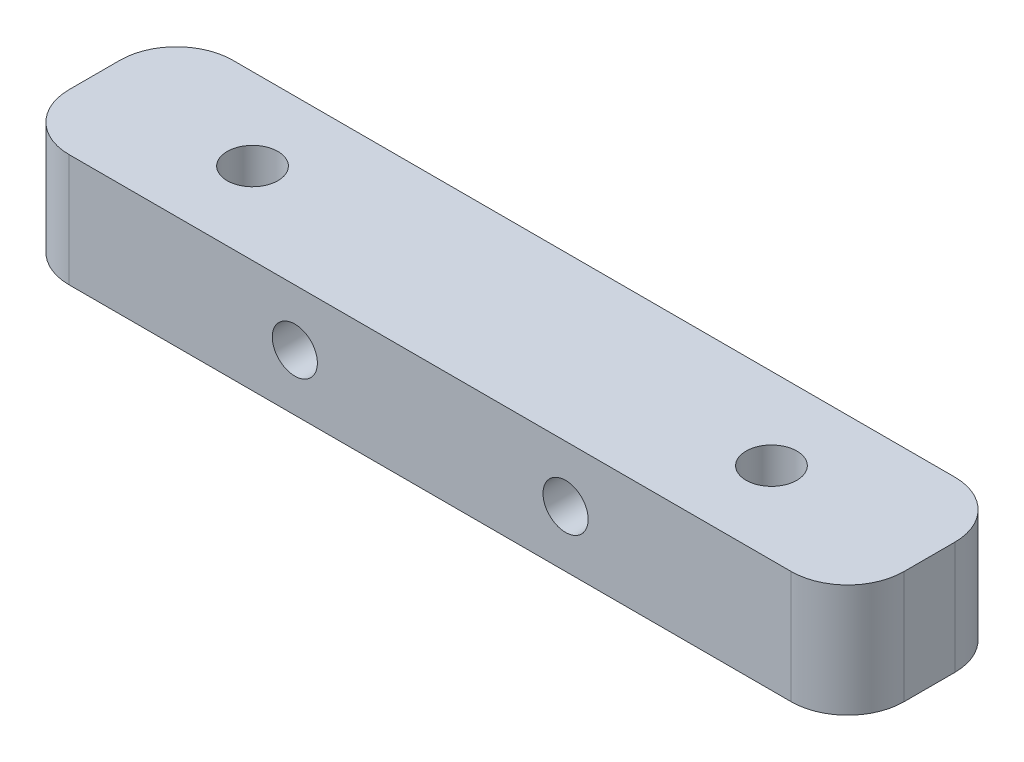
ISO-10303-21;
HEADER;
FILE_DESCRIPTION(('STEP AP214'),'2;1');
FILE_NAME('part.step','',(''),(''),'','','');
FILE_SCHEMA(('AUTOMOTIVE_DESIGN { 1 0 10303 214 1 1 1 1 }'));
ENDSEC;
DATA;
#1=APPLICATION_CONTEXT('core data for automotive mechanical design processes');
#2=APPLICATION_PROTOCOL_DEFINITION('international standard','automotive_design',2000,#1);
#3=PRODUCT_CONTEXT('',#1,'mechanical');
#4=PRODUCT('Part','Part','',(#3));
#5=PRODUCT_RELATED_PRODUCT_CATEGORY('part','',(#4));
#6=PRODUCT_DEFINITION_FORMATION('','',#4);
#7=PRODUCT_DEFINITION_CONTEXT('part definition',#1,'design');
#8=PRODUCT_DEFINITION('design','',#6,#7);
#9=PRODUCT_DEFINITION_SHAPE('','',#8);
#10=(LENGTH_UNIT() NAMED_UNIT(*) SI_UNIT(.MILLI.,.METRE.));
#11=(NAMED_UNIT(*) PLANE_ANGLE_UNIT() SI_UNIT($,.RADIAN.));
#12=(NAMED_UNIT(*) SI_UNIT($,.STERADIAN.) SOLID_ANGLE_UNIT());
#13=UNCERTAINTY_MEASURE_WITH_UNIT(LENGTH_MEASURE(1.E-05),#10,'distance_accuracy_value','');
#14=(GEOMETRIC_REPRESENTATION_CONTEXT(3) GLOBAL_UNCERTAINTY_ASSIGNED_CONTEXT((#13)) GLOBAL_UNIT_ASSIGNED_CONTEXT((#10,
#11,#12)) REPRESENTATION_CONTEXT('',''));
#15=CARTESIAN_POINT('',(0.,0.,0.));
#16=DIRECTION('',(0.,0.,1.));
#17=DIRECTION('',(1.,0.,0.));
#18=AXIS2_PLACEMENT_3D('',#15,#16,#17);
#19=CARTESIAN_POINT('',(32.,10.,-2.25));
#20=DIRECTION('',(0.,1.,0.));
#21=DIRECTION('',(0.,0.,1.));
#22=AXIS2_PLACEMENT_3D('',#19,#20,#21);
#23=PLANE('',#22);
#24=CARTESIAN_POINT('',(23.,10.,0.));
#25=DIRECTION('',(0.,1.,0.));
#26=DIRECTION('',(0.,0.,1.));
#27=AXIS2_PLACEMENT_3D('',#24,#25,#26);
#28=CIRCLE('',#27,2.24999999999998);
#29=CARTESIAN_POINT('',(23.,10.,2.24999999999998));
#30=VERTEX_POINT('',#29);
#31=EDGE_CURVE('E165',#30,#30,#28,.T.);
#32=ORIENTED_EDGE('',*,*,#31,.F.);
#33=EDGE_LOOP('',(#32));
#34=FACE_BOUND('',#33,.T.);
#35=DIRECTION('',(1.,0.,0.));
#36=VECTOR('',#35,1.);
#37=CARTESIAN_POINT('',(-37.,10.,7.25000000000001));
#38=LINE('',#37,#36);
#39=CARTESIAN_POINT('',(-32.,10.,7.25000000000001));
#40=VERTEX_POINT('',#39);
#41=CARTESIAN_POINT('',(32.,10.,7.25000000000001));
#42=VERTEX_POINT('',#41);
#43=EDGE_CURVE('E173',#40,#42,#38,.T.);
#44=ORIENTED_EDGE('',*,*,#43,.T.);
#45=CARTESIAN_POINT('',(32.,10.,2.25000000000001));
#46=DIRECTION('',(0.,1.,0.));
#47=DIRECTION('',(0.,0.,1.));
#48=AXIS2_PLACEMENT_3D('',#45,#46,#47);
#49=CIRCLE('',#48,5.);
#50=CARTESIAN_POINT('',(37.,10.,2.25000000000001));
#51=VERTEX_POINT('',#50);
#52=EDGE_CURVE('E42',#42,#51,#49,.T.);
#53=ORIENTED_EDGE('',*,*,#52,.T.);
#54=DIRECTION('',(0.,0.,-1.));
#55=VECTOR('',#54,1.);
#56=CARTESIAN_POINT('',(37.,10.,7.25000000000001));
#57=LINE('',#56,#55);
#58=CARTESIAN_POINT('',(37.,10.,-2.25));
#59=VERTEX_POINT('',#58);
#60=EDGE_CURVE('E118',#51,#59,#57,.T.);
#61=ORIENTED_EDGE('',*,*,#60,.T.);
#62=CARTESIAN_POINT('',(32.,10.,-2.25));
#63=DIRECTION('',(0.,1.,0.));
#64=DIRECTION('',(0.,0.,1.));
#65=AXIS2_PLACEMENT_3D('',#62,#63,#64);
#66=CIRCLE('',#65,4.99999999999999);
#67=CARTESIAN_POINT('',(32.,10.,-7.25000000000001));
#68=VERTEX_POINT('',#67);
#69=EDGE_CURVE('E113',#59,#68,#66,.T.);
#70=ORIENTED_EDGE('',*,*,#69,.T.);
#71=DIRECTION('',(-1.,0.,0.));
#72=VECTOR('',#71,1.);
#73=CARTESIAN_POINT('',(32.,10.,-7.25000000000001));
#74=LINE('',#73,#72);
#75=CARTESIAN_POINT('',(-32.,10.,-7.25));
#76=VERTEX_POINT('',#75);
#77=EDGE_CURVE('E102',#68,#76,#74,.T.);
#78=ORIENTED_EDGE('',*,*,#77,.T.);
#79=CARTESIAN_POINT('',(-32.,10.,-2.25));
#80=DIRECTION('',(0.,1.,0.));
#81=DIRECTION('',(0.,0.,1.));
#82=AXIS2_PLACEMENT_3D('',#79,#80,#81);
#83=CIRCLE('',#82,5.);
#84=CARTESIAN_POINT('',(-37.,10.,-2.25));
#85=VERTEX_POINT('',#84);
#86=EDGE_CURVE('E112',#76,#85,#83,.T.);
#87=ORIENTED_EDGE('',*,*,#86,.T.);
#88=DIRECTION('',(0.,0.,1.));
#89=VECTOR('',#88,1.);
#90=CARTESIAN_POINT('',(-37.,10.,-2.25));
#91=LINE('',#90,#89);
#92=CARTESIAN_POINT('',(-37.,10.,2.25000000000001));
#93=VERTEX_POINT('',#92);
#94=EDGE_CURVE('E171',#85,#93,#91,.T.);
#95=ORIENTED_EDGE('',*,*,#94,.T.);
#96=CARTESIAN_POINT('',(-32.,10.,2.25000000000001));
#97=DIRECTION('',(0.,1.,0.));
#98=DIRECTION('',(0.,0.,1.));
#99=AXIS2_PLACEMENT_3D('',#96,#97,#98);
#100=CIRCLE('',#99,5.);
#101=EDGE_CURVE('E143',#93,#40,#100,.T.);
#102=ORIENTED_EDGE('',*,*,#101,.T.);
#103=EDGE_LOOP('',(#44,#53,#61,#70,#78,#87,#95,#102));
#104=FACE_BOUND('',#103,.T.);
#105=CARTESIAN_POINT('',(-23.,10.,0.));
#106=DIRECTION('',(0.,1.,0.));
#107=DIRECTION('',(0.,0.,1.));
#108=AXIS2_PLACEMENT_3D('',#105,#106,#107);
#109=CIRCLE('',#108,2.25);
#110=CARTESIAN_POINT('',(-23.,10.,2.25));
#111=VERTEX_POINT('',#110);
#112=EDGE_CURVE('E152',#111,#111,#109,.T.);
#113=ORIENTED_EDGE('',*,*,#112,.F.);
#114=EDGE_LOOP('',(#113));
#115=FACE_BOUND('',#114,.T.);
#116=ADVANCED_FACE('F33',(#34,#104,#115),#23,.T.);
#117=CARTESIAN_POINT('',(32.,0.,-2.25));
#118=DIRECTION('',(0.,1.,0.));
#119=DIRECTION('',(0.,0.,1.));
#120=AXIS2_PLACEMENT_3D('',#117,#118,#119);
#121=PLANE('',#120);
#122=DIRECTION('',(0.,0.,-1.));
#123=VECTOR('',#122,1.);
#124=CARTESIAN_POINT('',(37.,0.,7.25000000000001));
#125=LINE('',#124,#123);
#126=CARTESIAN_POINT('',(37.,0.,2.25000000000001));
#127=VERTEX_POINT('',#126);
#128=CARTESIAN_POINT('',(37.,0.,-2.25));
#129=VERTEX_POINT('',#128);
#130=EDGE_CURVE('E122',#127,#129,#125,.T.);
#131=ORIENTED_EDGE('',*,*,#130,.F.);
#132=CARTESIAN_POINT('',(32.,0.,2.25000000000001));
#133=DIRECTION('',(0.,1.,0.));
#134=DIRECTION('',(0.,0.,1.));
#135=AXIS2_PLACEMENT_3D('',#132,#133,#134);
#136=CIRCLE('',#135,5.);
#137=CARTESIAN_POINT('',(32.,0.,7.25000000000001));
#138=VERTEX_POINT('',#137);
#139=EDGE_CURVE('E137',#127,#138,#136,.F.);
#140=ORIENTED_EDGE('',*,*,#139,.T.);
#141=DIRECTION('',(1.,0.,0.));
#142=VECTOR('',#141,1.);
#143=CARTESIAN_POINT('',(-37.,0.,7.25000000000001));
#144=LINE('',#143,#142);
#145=CARTESIAN_POINT('',(-32.,0.,7.25000000000001));
#146=VERTEX_POINT('',#145);
#147=EDGE_CURVE('E184',#146,#138,#144,.T.);
#148=ORIENTED_EDGE('',*,*,#147,.F.);
#149=CARTESIAN_POINT('',(-32.,0.,2.25000000000001));
#150=DIRECTION('',(0.,1.,0.));
#151=DIRECTION('',(0.,0.,1.));
#152=AXIS2_PLACEMENT_3D('',#149,#150,#151);
#153=CIRCLE('',#152,5.);
#154=CARTESIAN_POINT('',(-37.,0.,2.25000000000001));
#155=VERTEX_POINT('',#154);
#156=EDGE_CURVE('E130',#146,#155,#153,.F.);
#157=ORIENTED_EDGE('',*,*,#156,.T.);
#158=DIRECTION('',(0.,0.,1.));
#159=VECTOR('',#158,1.);
#160=CARTESIAN_POINT('',(-37.,0.,-2.25));
#161=LINE('',#160,#159);
#162=CARTESIAN_POINT('',(-37.,0.,-2.25));
#163=VERTEX_POINT('',#162);
#164=EDGE_CURVE('E182',#163,#155,#161,.T.);
#165=ORIENTED_EDGE('',*,*,#164,.F.);
#166=CARTESIAN_POINT('',(-32.,0.,-2.25));
#167=DIRECTION('',(0.,1.,0.));
#168=DIRECTION('',(0.,0.,1.));
#169=AXIS2_PLACEMENT_3D('',#166,#167,#168);
#170=CIRCLE('',#169,5.);
#171=CARTESIAN_POINT('',(-32.,0.,-7.25));
#172=VERTEX_POINT('',#171);
#173=EDGE_CURVE('E180',#172,#163,#170,.T.);
#174=ORIENTED_EDGE('',*,*,#173,.F.);
#175=DIRECTION('',(-1.,0.,0.));
#176=VECTOR('',#175,1.);
#177=CARTESIAN_POINT('',(32.,0.,-7.25000000000001));
#178=LINE('',#177,#176);
#179=CARTESIAN_POINT('',(32.,0.,-7.25000000000001));
#180=VERTEX_POINT('',#179);
#181=EDGE_CURVE('E178',#180,#172,#178,.T.);
#182=ORIENTED_EDGE('',*,*,#181,.F.);
#183=CARTESIAN_POINT('',(32.,0.,-2.25));
#184=DIRECTION('',(0.,1.,0.));
#185=DIRECTION('',(0.,0.,1.));
#186=AXIS2_PLACEMENT_3D('',#183,#184,#185);
#187=CIRCLE('',#186,4.99999999999999);
#188=EDGE_CURVE('E126',#129,#180,#187,.T.);
#189=ORIENTED_EDGE('',*,*,#188,.F.);
#190=EDGE_LOOP('',(#131,#140,#148,#157,#165,#174,#182,#189));
#191=FACE_BOUND('',#190,.T.);
#192=CARTESIAN_POINT('',(23.,0.,0.));
#193=DIRECTION('',(0.,1.,0.));
#194=DIRECTION('',(0.,0.,1.));
#195=AXIS2_PLACEMENT_3D('',#192,#193,#194);
#196=CIRCLE('',#195,2.24999999999998);
#197=CARTESIAN_POINT('',(23.,0.,2.24999999999998));
#198=VERTEX_POINT('',#197);
#199=EDGE_CURVE('E163',#198,#198,#196,.T.);
#200=ORIENTED_EDGE('',*,*,#199,.T.);
#201=EDGE_LOOP('',(#200));
#202=FACE_BOUND('',#201,.T.);
#203=CARTESIAN_POINT('',(-23.,0.,0.));
#204=DIRECTION('',(0.,1.,0.));
#205=DIRECTION('',(0.,0.,1.));
#206=AXIS2_PLACEMENT_3D('',#203,#204,#205);
#207=CIRCLE('',#206,2.25);
#208=CARTESIAN_POINT('',(-23.,0.,2.25));
#209=VERTEX_POINT('',#208);
#210=EDGE_CURVE('E147',#209,#209,#207,.T.);
#211=ORIENTED_EDGE('',*,*,#210,.T.);
#212=EDGE_LOOP('',(#211));
#213=FACE_BOUND('',#212,.T.);
#214=ADVANCED_FACE('F195',(#191,#202,#213),#121,.F.);
#215=CARTESIAN_POINT('',(32.,10.,-2.25));
#216=DIRECTION('',(0.,-1.,0.));
#217=DIRECTION('',(0.,0.,-1.));
#218=AXIS2_PLACEMENT_3D('',#215,#216,#217);
#219=CYLINDRICAL_SURFACE('',#218,4.99999999999999);
#220=ORIENTED_EDGE('',*,*,#188,.T.);
#221=DIRECTION('',(0.,-1.,0.));
#222=VECTOR('',#221,1.);
#223=CARTESIAN_POINT('',(32.,10.,-7.25000000000001));
#224=LINE('',#223,#222);
#225=EDGE_CURVE('E106',#68,#180,#224,.T.);
#226=ORIENTED_EDGE('',*,*,#225,.F.);
#227=ORIENTED_EDGE('',*,*,#69,.F.);
#228=DIRECTION('',(0.,-1.,0.));
#229=VECTOR('',#228,1.);
#230=CARTESIAN_POINT('',(37.,10.,-2.25));
#231=LINE('',#230,#229);
#232=EDGE_CURVE('E176',#59,#129,#231,.T.);
#233=ORIENTED_EDGE('',*,*,#232,.T.);
#234=EDGE_LOOP('',(#220,#226,#227,#233));
#235=FACE_BOUND('',#234,.T.);
#236=ADVANCED_FACE('F124',(#235),#219,.T.);
#237=CARTESIAN_POINT('',(32.,10.,-7.25000000000001));
#238=DIRECTION('',(0.,0.,1.));
#239=DIRECTION('',(1.,0.,0.));
#240=AXIS2_PLACEMENT_3D('',#237,#238,#239);
#241=PLANE('',#240);
#242=CARTESIAN_POINT('',(-12.,5.,-7.25000000000001));
#243=DIRECTION('',(0.,0.,-1.));
#244=DIRECTION('',(-1.,0.,0.));
#245=AXIS2_PLACEMENT_3D('',#242,#243,#244);
#246=CIRCLE('',#245,2.);
#247=CARTESIAN_POINT('',(-14.,5.,-7.25000000000001));
#248=VERTEX_POINT('',#247);
#249=EDGE_CURVE('E159',#248,#248,#246,.T.);
#250=ORIENTED_EDGE('',*,*,#249,.F.);
#251=EDGE_LOOP('',(#250));
#252=FACE_BOUND('',#251,.T.);
#253=CARTESIAN_POINT('',(12.,5.,-7.25000000000001));
#254=DIRECTION('',(0.,0.,-1.));
#255=DIRECTION('',(-1.,0.,0.));
#256=AXIS2_PLACEMENT_3D('',#253,#254,#255);
#257=CIRCLE('',#256,2.);
#258=CARTESIAN_POINT('',(10.,5.,-7.25000000000001));
#259=VERTEX_POINT('',#258);
#260=EDGE_CURVE('E148',#259,#259,#257,.T.);
#261=ORIENTED_EDGE('',*,*,#260,.F.);
#262=EDGE_LOOP('',(#261));
#263=FACE_BOUND('',#262,.T.);
#264=ORIENTED_EDGE('',*,*,#181,.T.);
#265=DIRECTION('',(0.,-1.,0.));
#266=VECTOR('',#265,1.);
#267=CARTESIAN_POINT('',(-32.,10.,-7.25));
#268=LINE('',#267,#266);
#269=EDGE_CURVE('E109',#76,#172,#268,.T.);
#270=ORIENTED_EDGE('',*,*,#269,.F.);
#271=ORIENTED_EDGE('',*,*,#77,.F.);
#272=ORIENTED_EDGE('',*,*,#225,.T.);
#273=EDGE_LOOP('',(#264,#270,#271,#272));
#274=FACE_BOUND('',#273,.T.);
#275=ADVANCED_FACE('F104',(#252,#263,#274),#241,.F.);
#276=CARTESIAN_POINT('',(-32.,10.,-2.25));
#277=DIRECTION('',(0.,-1.,0.));
#278=DIRECTION('',(0.,0.,-1.));
#279=AXIS2_PLACEMENT_3D('',#276,#277,#278);
#280=CYLINDRICAL_SURFACE('',#279,5.);
#281=ORIENTED_EDGE('',*,*,#173,.T.);
#282=DIRECTION('',(0.,-1.,0.));
#283=VECTOR('',#282,1.);
#284=CARTESIAN_POINT('',(-37.,10.,-2.25));
#285=LINE('',#284,#283);
#286=EDGE_CURVE('E132',#85,#163,#285,.T.);
#287=ORIENTED_EDGE('',*,*,#286,.F.);
#288=ORIENTED_EDGE('',*,*,#86,.F.);
#289=ORIENTED_EDGE('',*,*,#269,.T.);
#290=EDGE_LOOP('',(#281,#287,#288,#289));
#291=FACE_BOUND('',#290,.T.);
#292=ADVANCED_FACE('F208',(#291),#280,.T.);
#293=CARTESIAN_POINT('',(-37.,10.,-2.25));
#294=DIRECTION('',(1.,0.,0.));
#295=DIRECTION('',(0.,0.,-1.));
#296=AXIS2_PLACEMENT_3D('',#293,#294,#295);
#297=PLANE('',#296);
#298=ORIENTED_EDGE('',*,*,#164,.T.);
#299=DIRECTION('',(0.,-1.,0.));
#300=VECTOR('',#299,1.);
#301=CARTESIAN_POINT('',(-37.,10.,2.25000000000001));
#302=LINE('',#301,#300);
#303=EDGE_CURVE('E11',#155,#93,#302,.F.);
#304=ORIENTED_EDGE('',*,*,#303,.T.);
#305=ORIENTED_EDGE('',*,*,#94,.F.);
#306=ORIENTED_EDGE('',*,*,#286,.T.);
#307=EDGE_LOOP('',(#298,#304,#305,#306));
#308=FACE_BOUND('',#307,.T.);
#309=ADVANCED_FACE('F190',(#308),#297,.F.);
#310=CARTESIAN_POINT('',(-37.,10.,7.25000000000001));
#311=DIRECTION('',(0.,0.,-1.));
#312=DIRECTION('',(-1.,0.,0.));
#313=AXIS2_PLACEMENT_3D('',#310,#311,#312);
#314=PLANE('',#313);
#315=CARTESIAN_POINT('',(-12.,5.,7.25000000000001));
#316=DIRECTION('',(0.,0.,-1.));
#317=DIRECTION('',(-1.,0.,0.));
#318=AXIS2_PLACEMENT_3D('',#315,#316,#317);
#319=CIRCLE('',#318,2.);
#320=CARTESIAN_POINT('',(-14.,5.,7.25000000000001));
#321=VERTEX_POINT('',#320);
#322=EDGE_CURVE('E37',#321,#321,#319,.T.);
#323=ORIENTED_EDGE('',*,*,#322,.T.);
#324=EDGE_LOOP('',(#323));
#325=FACE_BOUND('',#324,.T.);
#326=CARTESIAN_POINT('',(12.,5.,7.25000000000001));
#327=DIRECTION('',(0.,0.,-1.));
#328=DIRECTION('',(-1.,0.,0.));
#329=AXIS2_PLACEMENT_3D('',#326,#327,#328);
#330=CIRCLE('',#329,2.);
#331=CARTESIAN_POINT('',(10.,5.,7.25000000000001));
#332=VERTEX_POINT('',#331);
#333=EDGE_CURVE('E145',#332,#332,#330,.T.);
#334=ORIENTED_EDGE('',*,*,#333,.T.);
#335=EDGE_LOOP('',(#334));
#336=FACE_BOUND('',#335,.T.);
#337=ORIENTED_EDGE('',*,*,#147,.T.);
#338=DIRECTION('',(0.,-1.,0.));
#339=VECTOR('',#338,1.);
#340=CARTESIAN_POINT('',(32.,10.,7.25000000000001));
#341=LINE('',#340,#339);
#342=EDGE_CURVE('E56',#138,#42,#341,.F.);
#343=ORIENTED_EDGE('',*,*,#342,.T.);
#344=ORIENTED_EDGE('',*,*,#43,.F.);
#345=DIRECTION('',(0.,-1.,0.));
#346=VECTOR('',#345,1.);
#347=CARTESIAN_POINT('',(-32.,10.,7.25000000000001));
#348=LINE('',#347,#346);
#349=EDGE_CURVE('E139',#40,#146,#348,.T.);
#350=ORIENTED_EDGE('',*,*,#349,.T.);
#351=EDGE_LOOP('',(#337,#343,#344,#350));
#352=FACE_BOUND('',#351,.T.);
#353=ADVANCED_FACE('F201',(#325,#336,#352),#314,.F.);
#354=CARTESIAN_POINT('',(37.,10.,7.25000000000001));
#355=DIRECTION('',(-1.,0.,0.));
#356=DIRECTION('',(0.,0.,1.));
#357=AXIS2_PLACEMENT_3D('',#354,#355,#356);
#358=PLANE('',#357);
#359=ORIENTED_EDGE('',*,*,#60,.F.);
#360=DIRECTION('',(0.,-1.,0.));
#361=VECTOR('',#360,1.);
#362=CARTESIAN_POINT('',(37.,10.,2.25000000000001));
#363=LINE('',#362,#361);
#364=EDGE_CURVE('E127',#51,#127,#363,.T.);
#365=ORIENTED_EDGE('',*,*,#364,.T.);
#366=ORIENTED_EDGE('',*,*,#130,.T.);
#367=ORIENTED_EDGE('',*,*,#232,.F.);
#368=EDGE_LOOP('',(#359,#365,#366,#367));
#369=FACE_BOUND('',#368,.T.);
#370=ADVANCED_FACE('F207',(#369),#358,.F.);
#371=CARTESIAN_POINT('',(23.,10.,0.));
#372=DIRECTION('',(0.,-1.,0.));
#373=DIRECTION('',(0.,0.,-1.));
#374=AXIS2_PLACEMENT_3D('',#371,#372,#373);
#375=CYLINDRICAL_SURFACE('',#374,2.24999999999998);
#376=ORIENTED_EDGE('',*,*,#31,.T.);
#377=EDGE_LOOP('',(#376));
#378=FACE_BOUND('',#377,.T.);
#379=ORIENTED_EDGE('',*,*,#199,.F.);
#380=EDGE_LOOP('',(#379));
#381=FACE_BOUND('',#380,.T.);
#382=ADVANCED_FACE('F228',(#378,#381),#375,.F.);
#383=CARTESIAN_POINT('',(-23.,10.,0.));
#384=DIRECTION('',(0.,-1.,0.));
#385=DIRECTION('',(0.,0.,-1.));
#386=AXIS2_PLACEMENT_3D('',#383,#384,#385);
#387=CYLINDRICAL_SURFACE('',#386,2.25);
#388=ORIENTED_EDGE('',*,*,#112,.T.);
#389=EDGE_LOOP('',(#388));
#390=FACE_BOUND('',#389,.T.);
#391=ORIENTED_EDGE('',*,*,#210,.F.);
#392=EDGE_LOOP('',(#391));
#393=FACE_BOUND('',#392,.T.);
#394=ADVANCED_FACE('F250',(#390,#393),#387,.F.);
#395=CARTESIAN_POINT('',(32.,10.,2.25000000000001));
#396=DIRECTION('',(0.,-1.,0.));
#397=DIRECTION('',(0.,0.,-1.));
#398=AXIS2_PLACEMENT_3D('',#395,#396,#397);
#399=CYLINDRICAL_SURFACE('',#398,5.);
#400=ORIENTED_EDGE('',*,*,#52,.F.);
#401=ORIENTED_EDGE('',*,*,#342,.F.);
#402=ORIENTED_EDGE('',*,*,#139,.F.);
#403=ORIENTED_EDGE('',*,*,#364,.F.);
#404=EDGE_LOOP('',(#400,#401,#402,#403));
#405=FACE_BOUND('',#404,.T.);
#406=ADVANCED_FACE('F205',(#405),#399,.T.);
#407=CARTESIAN_POINT('',(-32.,10.,2.25000000000001));
#408=DIRECTION('',(0.,-1.,0.));
#409=DIRECTION('',(0.,0.,-1.));
#410=AXIS2_PLACEMENT_3D('',#407,#408,#409);
#411=CYLINDRICAL_SURFACE('',#410,5.);
#412=ORIENTED_EDGE('',*,*,#101,.F.);
#413=ORIENTED_EDGE('',*,*,#303,.F.);
#414=ORIENTED_EDGE('',*,*,#156,.F.);
#415=ORIENTED_EDGE('',*,*,#349,.F.);
#416=EDGE_LOOP('',(#412,#413,#414,#415));
#417=FACE_BOUND('',#416,.T.);
#418=ADVANCED_FACE('F35',(#417),#411,.T.);
#419=CARTESIAN_POINT('',(12.,5.,16.75));
#420=DIRECTION('',(0.,0.,-1.));
#421=DIRECTION('',(-1.,0.,0.));
#422=AXIS2_PLACEMENT_3D('',#419,#420,#421);
#423=CYLINDRICAL_SURFACE('',#422,2.);
#424=ORIENTED_EDGE('',*,*,#260,.T.);
#425=EDGE_LOOP('',(#424));
#426=FACE_BOUND('',#425,.T.);
#427=ORIENTED_EDGE('',*,*,#333,.F.);
#428=EDGE_LOOP('',(#427));
#429=FACE_BOUND('',#428,.T.);
#430=ADVANCED_FACE('F242',(#426,#429),#423,.F.);
#431=CARTESIAN_POINT('',(-12.,5.,16.75));
#432=DIRECTION('',(0.,0.,-1.));
#433=DIRECTION('',(-1.,0.,0.));
#434=AXIS2_PLACEMENT_3D('',#431,#432,#433);
#435=CYLINDRICAL_SURFACE('',#434,2.);
#436=ORIENTED_EDGE('',*,*,#249,.T.);
#437=EDGE_LOOP('',(#436));
#438=FACE_BOUND('',#437,.T.);
#439=ORIENTED_EDGE('',*,*,#322,.F.);
#440=EDGE_LOOP('',(#439));
#441=FACE_BOUND('',#440,.T.);
#442=ADVANCED_FACE('F240',(#438,#441),#435,.F.);
#443=CLOSED_SHELL('',(#116,#214,#236,#275,#292,#309,#353,#370,#382,#394,#406,#418,#430,#442));
#444=MANIFOLD_SOLID_BREP('B2',#443);
#445=ADVANCED_BREP_SHAPE_REPRESENTATION('',(#18,#444),#14);
#446=SHAPE_DEFINITION_REPRESENTATION(#9,#445);
ENDSEC;
END-ISO-10303-21;
